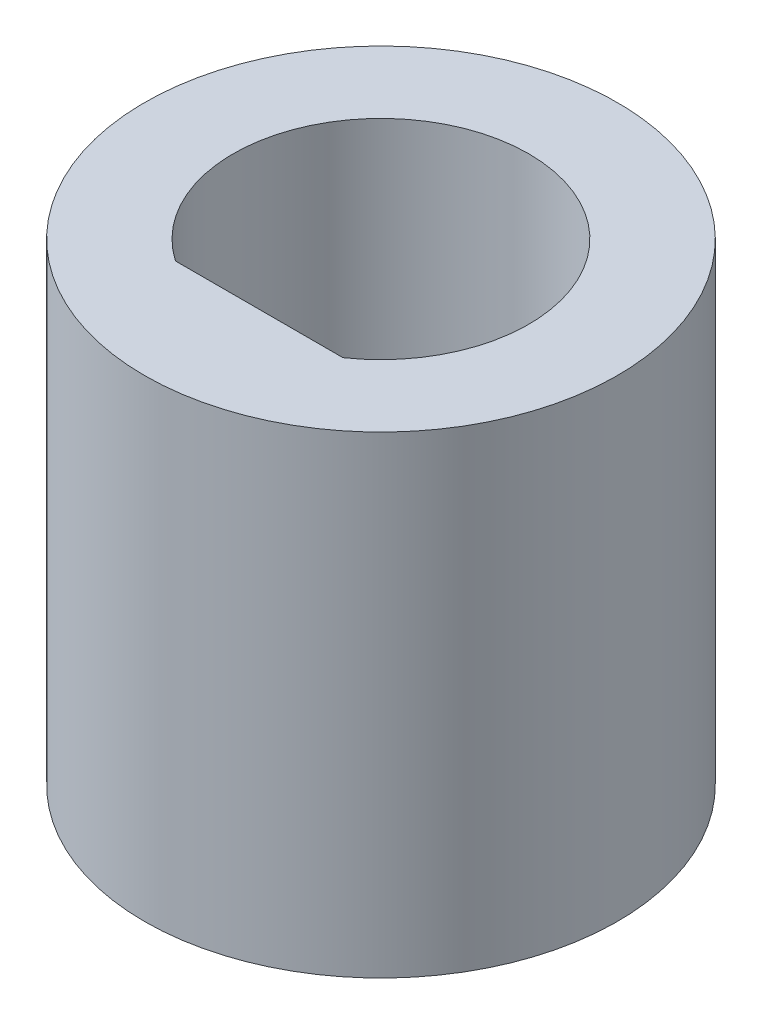
ISO-10303-21;
HEADER;
FILE_DESCRIPTION(('STEP AP214'),'2;1');
FILE_NAME('part.step','',(''),(''),'','','');
FILE_SCHEMA(('AUTOMOTIVE_DESIGN { 1 0 10303 214 1 1 1 1 }'));
ENDSEC;
DATA;
#1=APPLICATION_CONTEXT('core data for automotive mechanical design processes');
#2=APPLICATION_PROTOCOL_DEFINITION('international standard','automotive_design',2000,#1);
#3=PRODUCT_CONTEXT('',#1,'mechanical');
#4=PRODUCT('Part','Part','',(#3));
#5=PRODUCT_RELATED_PRODUCT_CATEGORY('part','',(#4));
#6=PRODUCT_DEFINITION_FORMATION('','',#4);
#7=PRODUCT_DEFINITION_CONTEXT('part definition',#1,'design');
#8=PRODUCT_DEFINITION('design','',#6,#7);
#9=PRODUCT_DEFINITION_SHAPE('','',#8);
#10=(LENGTH_UNIT() NAMED_UNIT(*) SI_UNIT(.MILLI.,.METRE.));
#11=(NAMED_UNIT(*) PLANE_ANGLE_UNIT() SI_UNIT($,.RADIAN.));
#12=(NAMED_UNIT(*) SI_UNIT($,.STERADIAN.) SOLID_ANGLE_UNIT());
#13=UNCERTAINTY_MEASURE_WITH_UNIT(LENGTH_MEASURE(1.E-05),#10,'distance_accuracy_value','');
#14=(GEOMETRIC_REPRESENTATION_CONTEXT(3) GLOBAL_UNCERTAINTY_ASSIGNED_CONTEXT((#13)) GLOBAL_UNIT_ASSIGNED_CONTEXT((#10,
#11,#12)) REPRESENTATION_CONTEXT('',''));
#15=CARTESIAN_POINT('',(0.,0.,0.));
#16=DIRECTION('',(0.,0.,1.));
#17=DIRECTION('',(1.,0.,0.));
#18=AXIS2_PLACEMENT_3D('',#15,#16,#17);
#19=CARTESIAN_POINT('',(0.,10.,0.));
#20=DIRECTION('',(0.,1.,0.));
#21=DIRECTION('',(0.,0.,1.));
#22=AXIS2_PLACEMENT_3D('',#19,#20,#21);
#23=PLANE('',#22);
#24=CARTESIAN_POINT('',(0.,10.,0.));
#25=DIRECTION('',(0.,1.,0.));
#26=DIRECTION('',(0.,0.,1.));
#27=AXIS2_PLACEMENT_3D('',#24,#25,#26);
#28=CIRCLE('',#27,5.);
#29=CARTESIAN_POINT('',(0.,10.,5.));
#30=VERTEX_POINT('',#29);
#31=EDGE_CURVE('E11',#30,#30,#28,.T.);
#32=ORIENTED_EDGE('',*,*,#31,.T.);
#33=EDGE_LOOP('',(#32));
#34=FACE_BOUND('',#33,.T.);
#35=DIRECTION('',(1.,0.,0.));
#36=VECTOR('',#35,1.);
#37=CARTESIAN_POINT('',(-1.77059312096258,10.,2.575));
#38=LINE('',#37,#36);
#39=CARTESIAN_POINT('',(-1.77059312096258,10.,2.575));
#40=VERTEX_POINT('',#39);
#41=CARTESIAN_POINT('',(1.77059312096258,10.,2.575));
#42=VERTEX_POINT('',#41);
#43=EDGE_CURVE('E74',#40,#42,#38,.T.);
#44=ORIENTED_EDGE('',*,*,#43,.F.);
#45=CARTESIAN_POINT('',(0.,10.,0.));
#46=DIRECTION('',(0.,1.,0.));
#47=DIRECTION('',(0.,0.,-1.));
#48=AXIS2_PLACEMENT_3D('',#45,#46,#47);
#49=CIRCLE('',#48,3.125);
#50=EDGE_CURVE('E65',#42,#40,#49,.T.);
#51=ORIENTED_EDGE('',*,*,#50,.F.);
#52=EDGE_LOOP('',(#44,#51));
#53=FACE_BOUND('',#52,.T.);
#54=ADVANCED_FACE('F33',(#34,#53),#23,.T.);
#55=CARTESIAN_POINT('',(0.,0.,0.));
#56=DIRECTION('',(0.,1.,0.));
#57=DIRECTION('',(0.,0.,1.));
#58=AXIS2_PLACEMENT_3D('',#55,#56,#57);
#59=PLANE('',#58);
#60=CARTESIAN_POINT('',(0.,0.,0.));
#61=DIRECTION('',(0.,1.,0.));
#62=DIRECTION('',(0.,0.,1.));
#63=AXIS2_PLACEMENT_3D('',#60,#61,#62);
#64=CIRCLE('',#63,5.);
#65=CARTESIAN_POINT('',(0.,0.,5.));
#66=VERTEX_POINT('',#65);
#67=EDGE_CURVE('E37',#66,#66,#64,.T.);
#68=ORIENTED_EDGE('',*,*,#67,.F.);
#69=EDGE_LOOP('',(#68));
#70=FACE_BOUND('',#69,.T.);
#71=CARTESIAN_POINT('',(0.,0.,0.));
#72=DIRECTION('',(0.,1.,0.));
#73=DIRECTION('',(0.,0.,-1.));
#74=AXIS2_PLACEMENT_3D('',#71,#72,#73);
#75=CIRCLE('',#74,3.125);
#76=CARTESIAN_POINT('',(1.77059312096258,0.,2.575));
#77=VERTEX_POINT('',#76);
#78=CARTESIAN_POINT('',(-1.77059312096258,0.,2.575));
#79=VERTEX_POINT('',#78);
#80=EDGE_CURVE('E55',#77,#79,#75,.T.);
#81=ORIENTED_EDGE('',*,*,#80,.T.);
#82=DIRECTION('',(1.,0.,0.));
#83=VECTOR('',#82,1.);
#84=CARTESIAN_POINT('',(-1.77059312096258,0.,2.575));
#85=LINE('',#84,#83);
#86=EDGE_CURVE('E61',#79,#77,#85,.T.);
#87=ORIENTED_EDGE('',*,*,#86,.T.);
#88=EDGE_LOOP('',(#81,#87));
#89=FACE_BOUND('',#88,.T.);
#90=ADVANCED_FACE('F71',(#70,#89),#59,.F.);
#91=CARTESIAN_POINT('',(0.,10.,0.));
#92=DIRECTION('',(0.,-1.,0.));
#93=DIRECTION('',(0.,0.,-1.));
#94=AXIS2_PLACEMENT_3D('',#91,#92,#93);
#95=CYLINDRICAL_SURFACE('',#94,5.);
#96=ORIENTED_EDGE('',*,*,#31,.F.);
#97=EDGE_LOOP('',(#96));
#98=FACE_BOUND('',#97,.T.);
#99=ORIENTED_EDGE('',*,*,#67,.T.);
#100=EDGE_LOOP('',(#99));
#101=FACE_BOUND('',#100,.T.);
#102=ADVANCED_FACE('F35',(#98,#101),#95,.T.);
#103=CARTESIAN_POINT('',(0.,10.,0.));
#104=DIRECTION('',(0.,-1.,0.));
#105=DIRECTION('',(0.,0.,-1.));
#106=AXIS2_PLACEMENT_3D('',#103,#104,#105);
#107=CYLINDRICAL_SURFACE('',#106,3.125);
#108=ORIENTED_EDGE('',*,*,#80,.F.);
#109=DIRECTION('',(0.,-1.,0.));
#110=VECTOR('',#109,1.);
#111=CARTESIAN_POINT('',(1.77059312096258,10.,2.575));
#112=LINE('',#111,#110);
#113=EDGE_CURVE('E63',#42,#77,#112,.T.);
#114=ORIENTED_EDGE('',*,*,#113,.F.);
#115=ORIENTED_EDGE('',*,*,#50,.T.);
#116=DIRECTION('',(0.,-1.,0.));
#117=VECTOR('',#116,1.);
#118=CARTESIAN_POINT('',(-1.77059312096258,10.,2.575));
#119=LINE('',#118,#117);
#120=EDGE_CURVE('E48',#40,#79,#119,.T.);
#121=ORIENTED_EDGE('',*,*,#120,.T.);
#122=EDGE_LOOP('',(#108,#114,#115,#121));
#123=FACE_BOUND('',#122,.T.);
#124=ADVANCED_FACE('F67',(#123),#107,.F.);
#125=CARTESIAN_POINT('',(-1.77059312096258,10.,2.575));
#126=DIRECTION('',(0.,0.,-1.));
#127=DIRECTION('',(-1.,0.,0.));
#128=AXIS2_PLACEMENT_3D('',#125,#126,#127);
#129=PLANE('',#128);
#130=ORIENTED_EDGE('',*,*,#86,.F.);
#131=ORIENTED_EDGE('',*,*,#120,.F.);
#132=ORIENTED_EDGE('',*,*,#43,.T.);
#133=ORIENTED_EDGE('',*,*,#113,.T.);
#134=EDGE_LOOP('',(#130,#131,#132,#133));
#135=FACE_BOUND('',#134,.T.);
#136=ADVANCED_FACE('F62',(#135),#129,.T.);
#137=CLOSED_SHELL('',(#54,#90,#102,#124,#136));
#138=MANIFOLD_SOLID_BREP('B2',#137);
#139=ADVANCED_BREP_SHAPE_REPRESENTATION('',(#18,#138),#14);
#140=SHAPE_DEFINITION_REPRESENTATION(#9,#139);
ENDSEC;
END-ISO-10303-21;
